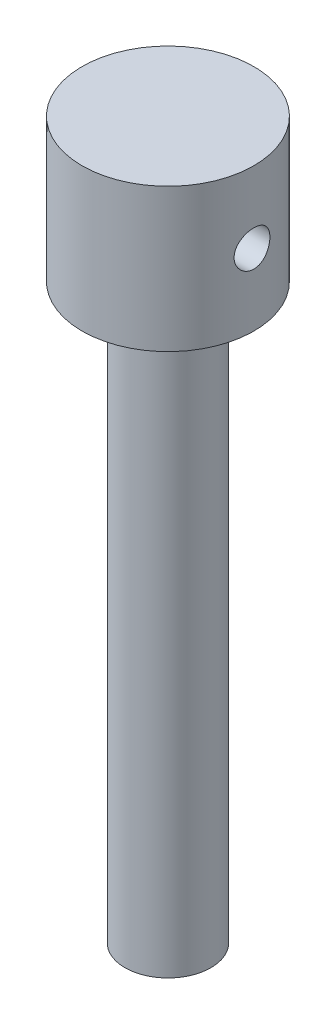
ISO-10303-21;
HEADER;
FILE_DESCRIPTION(('STEP AP214'),'2;1');
FILE_NAME('part.step','',(''),(''),'','','');
FILE_SCHEMA(('AUTOMOTIVE_DESIGN { 1 0 10303 214 1 1 1 1 }'));
ENDSEC;
DATA;
#1=APPLICATION_CONTEXT('core data for automotive mechanical design processes');
#2=APPLICATION_PROTOCOL_DEFINITION('international standard','automotive_design',2000,#1);
#3=PRODUCT_CONTEXT('',#1,'mechanical');
#4=PRODUCT('Part','Part','',(#3));
#5=PRODUCT_RELATED_PRODUCT_CATEGORY('part','',(#4));
#6=PRODUCT_DEFINITION_FORMATION('','',#4);
#7=PRODUCT_DEFINITION_CONTEXT('part definition',#1,'design');
#8=PRODUCT_DEFINITION('design','',#6,#7);
#9=PRODUCT_DEFINITION_SHAPE('','',#8);
#10=(LENGTH_UNIT() NAMED_UNIT(*) SI_UNIT(.MILLI.,.METRE.));
#11=(NAMED_UNIT(*) PLANE_ANGLE_UNIT() SI_UNIT($,.RADIAN.));
#12=(NAMED_UNIT(*) SI_UNIT($,.STERADIAN.) SOLID_ANGLE_UNIT());
#13=UNCERTAINTY_MEASURE_WITH_UNIT(LENGTH_MEASURE(1.E-05),#10,'distance_accuracy_value','');
#14=(GEOMETRIC_REPRESENTATION_CONTEXT(3) GLOBAL_UNCERTAINTY_ASSIGNED_CONTEXT((#13)) GLOBAL_UNIT_ASSIGNED_CONTEXT((#10,
#11,#12)) REPRESENTATION_CONTEXT('',''));
#15=CARTESIAN_POINT('',(0.,0.,0.));
#16=DIRECTION('',(0.,0.,1.));
#17=DIRECTION('',(1.,0.,0.));
#18=AXIS2_PLACEMENT_3D('',#15,#16,#17);
#19=CARTESIAN_POINT('',(0.,80.,0.));
#20=DIRECTION('',(0.,-1.,0.));
#21=DIRECTION('',(0.,0.,-1.));
#22=AXIS2_PLACEMENT_3D('',#19,#20,#21);
#23=CYLINDRICAL_SURFACE('',#22,6.);
#24=CARTESIAN_POINT('',(0.,80.,0.));
#25=DIRECTION('',(0.,1.,0.));
#26=DIRECTION('',(0.,0.,1.));
#27=AXIS2_PLACEMENT_3D('',#24,#25,#26);
#28=CIRCLE('',#27,6.);
#29=CARTESIAN_POINT('',(0.,80.,6.));
#30=VERTEX_POINT('',#29);
#31=EDGE_CURVE('E56',#30,#30,#28,.T.);
#32=ORIENTED_EDGE('',*,*,#31,.F.);
#33=EDGE_LOOP('',(#32));
#34=FACE_BOUND('',#33,.T.);
#35=CARTESIAN_POINT('',(0.,0.,0.));
#36=DIRECTION('',(0.,1.,0.));
#37=DIRECTION('',(0.,0.,1.));
#38=AXIS2_PLACEMENT_3D('',#35,#36,#37);
#39=CIRCLE('',#38,6.);
#40=CARTESIAN_POINT('',(0.,0.,6.));
#41=VERTEX_POINT('',#40);
#42=EDGE_CURVE('E60',#41,#41,#39,.T.);
#43=ORIENTED_EDGE('',*,*,#42,.T.);
#44=EDGE_LOOP('',(#43));
#45=FACE_BOUND('',#44,.T.);
#46=ADVANCED_FACE('F41',(#34,#45),#23,.T.);
#47=CARTESIAN_POINT('',(0.,0.,0.));
#48=DIRECTION('',(0.,1.,0.));
#49=DIRECTION('',(0.,0.,1.));
#50=AXIS2_PLACEMENT_3D('',#47,#48,#49);
#51=PLANE('',#50);
#52=ORIENTED_EDGE('',*,*,#42,.F.);
#53=EDGE_LOOP('',(#52));
#54=FACE_BOUND('',#53,.T.);
#55=ADVANCED_FACE('F86',(#54),#51,.F.);
#56=CARTESIAN_POINT('',(0.,100.,0.));
#57=DIRECTION('',(0.,-1.,0.));
#58=DIRECTION('',(0.,0.,-1.));
#59=AXIS2_PLACEMENT_3D('',#56,#57,#58);
#60=CYLINDRICAL_SURFACE('',#59,12.);
#61=CARTESIAN_POINT('',(-12.,87.5,0.));
#62=CARTESIAN_POINT('',(-11.999997430533,87.5000049549384,-0.138818083403322));
#63=CARTESIAN_POINT('',(-11.9975665755009,87.5116013314375,-0.277697579041752));
#64=CARTESIAN_POINT('',(-11.9881040198136,87.5576386990657,-0.551522632533988));
#65=CARTESIAN_POINT('',(-11.981068823785,87.5920970460739,-0.686465120256626));
#66=CARTESIAN_POINT('',(-11.963182183924,87.6827409098437,-0.948418264582685));
#67=CARTESIAN_POINT('',(-11.9523345410529,87.7389047919978,-1.07543667341837));
#68=CARTESIAN_POINT('',(-11.9279985561972,87.8712992177124,-1.31824065721192));
#69=CARTESIAN_POINT('',(-11.9145103325195,87.9475288623117,-1.43402673506865));
#70=CARTESIAN_POINT('',(-11.886154000493,88.1190726803813,-1.65278064861767));
#71=CARTESIAN_POINT('',(-11.8712701169706,88.2146240024702,-1.75556048832537));
#72=CARTESIAN_POINT('',(-11.841913153849,88.4215893183902,-1.94375555353879));
#73=CARTESIAN_POINT('',(-11.8274401083337,88.5330046237445,-2.02916934192198));
#74=CARTESIAN_POINT('',(-11.8003888519062,88.7699039375323,-2.18102063354433));
#75=CARTESIAN_POINT('',(-11.7878309034966,88.8955167690055,-2.24726109361302));
#76=CARTESIAN_POINT('',(-11.7662568130004,89.1563949035455,-2.35762238696128));
#77=CARTESIAN_POINT('',(-11.7572402893514,89.2916591648851,-2.40174560335283));
#78=CARTESIAN_POINT('',(-11.7439300197224,89.5659704748313,-2.46600480267474));
#79=CARTESIAN_POINT('',(-11.7395711371173,89.7049367186695,-2.48647195393598));
#80=CARTESIAN_POINT('',(-11.7358738143298,89.9843936857253,-2.5038671531123));
#81=CARTESIAN_POINT('',(-11.7365348160196,90.1248842377306,-2.50079781789374));
#82=CARTESIAN_POINT('',(-11.7427434863835,90.4009620559504,-2.47147438074394));
#83=CARTESIAN_POINT('',(-11.748210673598,90.5365919593224,-2.44560210465441));
#84=CARTESIAN_POINT('',(-11.7632887523188,90.8015430192899,-2.37201087059891));
#85=CARTESIAN_POINT('',(-11.7728998568263,90.9308638512127,-2.32429078962764));
#86=CARTESIAN_POINT('',(-11.795263829282,91.180614456832,-2.20800006427857));
#87=CARTESIAN_POINT('',(-11.8080390757117,91.3009725930542,-2.13928005068474));
#88=CARTESIAN_POINT('',(-11.8352778002144,91.5285914885363,-1.98304539854963));
#89=CARTESIAN_POINT('',(-11.8497414879707,91.635850617672,-1.89552842452517));
#90=CARTESIAN_POINT('',(-11.8790746185982,91.8364279221608,-1.70214984309357));
#91=CARTESIAN_POINT('',(-11.8939464639895,91.929432337794,-1.59596286682417));
#92=CARTESIAN_POINT('',(-11.92216176286,92.096360884458,-1.3693345772236));
#93=CARTESIAN_POINT('',(-11.9355051934047,92.1702847291968,-1.24889305005154));
#94=CARTESIAN_POINT('',(-11.9591974188563,92.2970201630719,-0.99681108247096));
#95=CARTESIAN_POINT('',(-11.9695407942052,92.3497936091342,-0.865150923853003));
#96=CARTESIAN_POINT('',(-11.9860267642256,92.432383409671,-0.594569241944315));
#97=CARTESIAN_POINT('',(-11.9921699119211,92.4622027864628,-0.455648677190184));
#98=CARTESIAN_POINT('',(-11.9994855043091,92.4975885041358,-0.177183731401676));
#99=CARTESIAN_POINT('',(-12.0007458707516,92.5035838829885,-0.0376961110523615));
#100=CARTESIAN_POINT('',(-11.9983990450555,92.4923101000618,0.240287597515427));
#101=CARTESIAN_POINT('',(-11.9947921509631,92.4750423627968,0.378783745924516));
#102=CARTESIAN_POINT('',(-11.9831712995837,92.418088693061,0.649452734239626));
#103=CARTESIAN_POINT('',(-11.9752010573615,92.3786250292331,0.78167438578841));
#104=CARTESIAN_POINT('',(-11.9557445448479,92.2786442791572,1.03762289332266));
#105=CARTESIAN_POINT('',(-11.9442579948916,92.2181255182681,1.16134907267355));
#106=CARTESIAN_POINT('',(-11.9188248298143,92.0768392435249,1.39858861388699));
#107=CARTESIAN_POINT('',(-11.9048478762466,91.9958161408619,1.51194643893967));
#108=CARTESIAN_POINT('',(-11.8760513659942,91.8161608738475,1.72361089177304));
#109=CARTESIAN_POINT('',(-11.8612317108502,91.7175266489621,1.82191575582657));
#110=CARTESIAN_POINT('',(-11.8321204906275,91.5034888460006,2.0023572973036));
#111=CARTESIAN_POINT('',(-11.81784178615,91.3878339360895,2.08419829200409));
#112=CARTESIAN_POINT('',(-11.7917120203161,91.1441674315724,2.22729438158487));
#113=CARTESIAN_POINT('',(-11.779860857893,91.0161563517218,2.28855033355728));
#114=CARTESIAN_POINT('',(-11.7600340141608,90.7520776074036,2.38834492887844));
#115=CARTESIAN_POINT('',(-11.7520374556937,90.6160579256683,2.42700619656063));
#116=CARTESIAN_POINT('',(-11.7407836941939,90.3392668990155,2.48088077046815));
#117=CARTESIAN_POINT('',(-11.7375258132073,90.1984962367611,2.49609743088882));
#118=CARTESIAN_POINT('',(-11.7361581461701,89.9191731980007,2.50251852975223));
#119=CARTESIAN_POINT('',(-11.73794804643,89.7806318595559,2.49419085245451));
#120=CARTESIAN_POINT('',(-11.7462489450985,89.5069719821596,2.45479810628064));
#121=CARTESIAN_POINT('',(-11.7527598981925,89.3718534103678,2.42373325564532));
#122=CARTESIAN_POINT('',(-11.7697226489543,89.1092044562187,2.3399643553717));
#123=CARTESIAN_POINT('',(-11.7801631401586,88.9816535070262,2.28732235136843));
#124=CARTESIAN_POINT('',(-11.8038141147748,88.7371224479467,2.16194914599515));
#125=CARTESIAN_POINT('',(-11.8170248553092,88.6201433207338,2.08921607966061));
#126=CARTESIAN_POINT('',(-11.8450315910229,88.3977567458411,1.92414739068483));
#127=CARTESIAN_POINT('',(-11.8598522773681,88.29260175087,1.83147578083645));
#128=CARTESIAN_POINT('',(-11.8892367916643,88.0991810135473,1.62984887623067));
#129=CARTESIAN_POINT('',(-11.9038005596976,88.010919164897,1.52088983766594));
#130=CARTESIAN_POINT('',(-11.9312288909527,87.8528228536319,1.28826885501542));
#131=CARTESIAN_POINT('',(-11.9440719214649,87.7832126402274,1.16445184304271));
#132=CARTESIAN_POINT('',(-11.9663981698818,87.66589954314,0.906639687996913));
#133=CARTESIAN_POINT('',(-11.975884323642,87.6181775056362,0.772653563814491));
#134=CARTESIAN_POINT('',(-11.9886499956289,87.5549194434232,0.532030585800209));
#135=CARTESIAN_POINT('',(-11.9928807132279,87.5343624735823,0.426735187455856));
#136=CARTESIAN_POINT('',(-11.9985566557952,87.5069010914453,0.214305348353072));
#137=CARTESIAN_POINT('',(-12.0000019836917,87.4999961746656,0.107170975697743));
#138=CARTESIAN_POINT('',(-12.,87.5,0.));
#139=B_SPLINE_CURVE_WITH_KNOTS('',3,(#61,#62,#63,#64,#65,#66,#67,#68,#69,#70,#71,#72,#73,#74,
#75,#76,#77,#78,#79,#80,#81,#82,#83,#84,#85,#86,#87,#88,#89,#90,#91,#92,#93,#94,#95,#96,#97,#98,
#99,#100,#101,#102,#103,#104,#105,#106,#107,#108,#109,#110,#111,#112,#113,#114,#115,#116,#117,
#118,#119,#120,#121,#122,#123,#124,#125,#126,#127,#128,#129,#130,#131,#132,#133,#134,#135,#136,
#137,#138),.UNSPECIFIED.,.T.,.F.,(4,2,2,2,2,2,2,2,2,2,2,2,2,2,2,2,2,2,2,2,2,2,2,2,2,2,2,2,2,2,2,
2,2,2,2,2,2,2,4),(0.,0.416062090206368,0.832440399812451,1.24840475765089,1.66435048314598,
2.08575052776244,2.50718543103572,2.93280898357096,3.35838666570981,3.77793150339709,
4.1974296953433,4.61003424258119,5.0226600006056,5.43829184833499,5.85397536736069,
6.27779052710931,6.70161204556436,7.12619448999324,7.55072102091542,7.96756678815351,
8.38438703104555,8.79710573265243,9.20985726781866,9.62803167991474,10.0462550512915,
10.4714252765867,10.8965777970262,11.3194010019005,11.7421637082837,12.1565844658208,
12.5710012456272,12.9842346278651,13.3975063816296,13.8183804966062,14.2393515023474,
14.6651772879651,15.0906297292995,15.4118517695456,15.7330619394678),.UNSPECIFIED.);
#140=CARTESIAN_POINT('',(-12.,87.5,0.));
#141=VERTEX_POINT('',#140);
#142=EDGE_CURVE('E10',#141,#141,#139,.T.);
#143=ORIENTED_EDGE('',*,*,#142,.T.);
#144=EDGE_LOOP('',(#143));
#145=FACE_BOUND('',#144,.T.);
#146=CARTESIAN_POINT('',(11.7366945943055,90.,-2.5));
#147=CARTESIAN_POINT('',(11.7366973843002,89.8612187696963,-2.499995017553));
#148=CARTESIAN_POINT('',(11.7391829184982,89.7223760559691,-2.48840458867923));
#149=CARTESIAN_POINT('',(11.7488403116286,89.448627365366,-2.44239298467531));
#150=CARTESIAN_POINT('',(11.7560157627658,89.3137244889873,-2.40795430880677));
#151=CARTESIAN_POINT('',(11.7742058592406,89.0518552543301,-2.31736795014468));
#152=CARTESIAN_POINT('',(11.7852165141394,88.9248808080164,-2.26124282497867));
#153=CARTESIAN_POINT('',(11.8098316267143,88.6821510007088,-2.12893977203463));
#154=CARTESIAN_POINT('',(11.8234359795523,88.56639518654,-2.05276265471639));
#155=CARTESIAN_POINT('',(11.8519386932295,88.3476092496931,-1.88127279893217));
#156=CARTESIAN_POINT('',(11.8668522874608,88.2447762127471,-1.78571110973934));
#157=CARTESIAN_POINT('',(11.8961593360515,88.0564778627038,-1.57870244776127));
#158=CARTESIAN_POINT('',(11.9105527521983,87.9710138234171,-1.467254310912));
#159=CARTESIAN_POINT('',(11.937362702377,87.8191082238343,-1.23032410599918));
#160=CARTESIAN_POINT('',(11.9497591726249,87.7528549470735,-1.10471885640988));
#161=CARTESIAN_POINT('',(11.971006946866,87.6424678942805,-0.843857102013438));
#162=CARTESIAN_POINT('',(11.9798586112245,87.5983318696929,-0.708601579901186));
#163=CARTESIAN_POINT('',(11.9929117978436,87.5340484777651,-0.434325808401012));
#164=CARTESIAN_POINT('',(11.9971778391985,87.5135679656097,-0.295386761832721));
#165=CARTESIAN_POINT('',(12.0008022516122,87.496136608486,-0.015983697679052));
#166=CARTESIAN_POINT('',(12.0001611340738,87.4991833116138,0.124480159473674));
#167=CARTESIAN_POINT('',(11.9940931618102,87.5284692019135,0.400653172399141));
#168=CARTESIAN_POINT('',(11.9887403791317,87.5543494379162,0.536402257452948));
#169=CARTESIAN_POINT('',(11.9739344179777,87.6279972506626,0.801587492579502));
#170=CARTESIAN_POINT('',(11.9644810658381,87.6757657544062,0.931023375022043));
#171=CARTESIAN_POINT('',(11.9424153464785,87.792160104251,1.18092001076937));
#172=CARTESIAN_POINT('',(11.9297820825069,87.8609245884193,1.3013142699633));
#173=CARTESIAN_POINT('',(11.9027460088038,88.0172560056808,1.5289869130213));
#174=CARTESIAN_POINT('',(11.8883429791665,88.1048252764123,1.63626366363284));
#175=CARTESIAN_POINT('',(11.8590340046655,88.2982432497821,1.83678840655382));
#176=CARTESIAN_POINT('',(11.8441236995185,88.4044061199639,1.92973297498959));
#177=CARTESIAN_POINT('',(11.8157374529799,88.6309640979896,2.09655194480976));
#178=CARTESIAN_POINT('',(11.8022615435432,88.7513595227745,2.1704259213996));
#179=CARTESIAN_POINT('',(11.7782599681831,89.0034245096576,2.29712434276909));
#180=CARTESIAN_POINT('',(11.7677417046425,89.1351213013869,2.34989610979455));
#181=CARTESIAN_POINT('',(11.7509521282072,89.4057832387388,2.43247155077345));
#182=CARTESIAN_POINT('',(11.7446802101436,89.5447473456162,2.46227849764697));
#183=CARTESIAN_POINT('',(11.7372156647826,89.8232394126378,2.49761727734035));
#184=CARTESIAN_POINT('',(11.7359310372695,89.9627091690741,2.50358885835997));
#185=CARTESIAN_POINT('',(11.7383390403741,90.2406516230803,2.49227386878589));
#186=CARTESIAN_POINT('',(11.7420313630525,90.3791243818047,2.47498873715726));
#187=CARTESIAN_POINT('',(11.7538907645233,90.6496410321163,2.41803116650968));
#188=CARTESIAN_POINT('',(11.76201022566,90.7817373343577,2.37859682753743));
#189=CARTESIAN_POINT('',(11.7817667700624,91.0374479788832,2.27871621721838));
#190=CARTESIAN_POINT('',(11.7934041638211,91.1610615713008,2.21826809112292));
#191=CARTESIAN_POINT('',(11.8190900387438,91.3982128824325,2.07709196362969));
#192=CARTESIAN_POINT('',(11.8331701329665,91.5115844089324,1.99609065470792));
#193=CARTESIAN_POINT('',(11.8620696798782,91.7232864983101,1.81646888113976));
#194=CARTESIAN_POINT('',(11.8768892153306,91.8216153724785,1.71784644101035));
#195=CARTESIAN_POINT('',(11.9058984863347,92.0021254261944,1.50380090168668));
#196=CARTESIAN_POINT('',(11.9200734943982,92.0840081900528,1.3881238152291));
#197=CARTESIAN_POINT('',(11.9459341754481,92.227177504176,1.14440020443272));
#198=CARTESIAN_POINT('',(11.9576199584164,92.2884649644749,1.01635422695377));
#199=CARTESIAN_POINT('',(11.9771229654136,92.3882773586347,0.752284235695844));
#200=CARTESIAN_POINT('',(11.9849632627299,92.4269383310887,0.616313421940395));
#201=CARTESIAN_POINT('',(11.9959912282046,92.4808288080162,0.339626801006947));
#202=CARTESIAN_POINT('',(11.9991795068579,92.4960613870655,0.198911618923389));
#203=CARTESIAN_POINT('',(12.0005281611387,92.502535244097,-0.0804266869406682));
#204=CARTESIAN_POINT('',(11.9987822750957,92.4942237999895,-0.219039184355818));
#205=CARTESIAN_POINT('',(11.99065748189,92.4548387226941,-0.492845740747125));
#206=CARTESIAN_POINT('',(11.9842786434588,92.4237654271863,-0.628039850405488));
#207=CARTESIAN_POINT('',(11.9676092015489,92.339944410703,-0.890863930984019));
#208=CARTESIAN_POINT('',(11.9573290681437,92.2872546722944,-1.01851310000873));
#209=CARTESIAN_POINT('',(11.9339599069615,92.1617552045355,-1.26322113444179));
#210=CARTESIAN_POINT('',(11.9208706346327,92.0889437233117,-1.38027907656019));
#211=CARTESIAN_POINT('',(11.8930319356995,91.9237806640155,-1.60268064259533));
#212=CARTESIAN_POINT('',(11.8782576059507,91.8311114238945,-1.70778526722738));
#213=CARTESIAN_POINT('',(11.8488557363333,91.6295109979979,-1.90110548396523));
#214=CARTESIAN_POINT('',(11.8342282323044,91.5205759400736,-1.98931704315914));
#215=CARTESIAN_POINT('',(11.8065838324643,91.287981795159,-2.14734903704121));
#216=CARTESIAN_POINT('',(11.7935881325424,91.1641631771794,-2.21693856248136));
#217=CARTESIAN_POINT('',(11.7709407916825,90.9063496879379,-2.3342125584477));
#218=CARTESIAN_POINT('',(11.7612862067076,90.7723639031215,-2.381916325835));
#219=CARTESIAN_POINT('',(11.7482800883641,90.5317874368468,-2.44513108264677));
#220=CARTESIAN_POINT('',(11.7439632719021,90.4265409268095,-2.46566898011599));
#221=CARTESIAN_POINT('',(11.7381695052653,90.2142084389624,-2.4931050871655));
#222=CARTESIAN_POINT('',(11.7366924407628,90.1071225353813,-2.50000384585404));
#223=CARTESIAN_POINT('',(11.7366945943055,90.,-2.5));
#224=B_SPLINE_CURVE_WITH_KNOTS('',3,(#146,#147,#148,#149,#150,#151,#152,#153,#154,#155,#156,
#157,#158,#159,#160,#161,#162,#163,#164,#165,#166,#167,#168,#169,#170,#171,#172,#173,#174,#175,
#176,#177,#178,#179,#180,#181,#182,#183,#184,#185,#186,#187,#188,#189,#190,#191,#192,#193,#194,
#195,#196,#197,#198,#199,#200,#201,#202,#203,#204,#205,#206,#207,#208,#209,#210,#211,#212,#213,
#214,#215,#216,#217,#218,#219,#220,#221,#222,#223),.UNSPECIFIED.,.T.,.F.,(4,2,2,2,2,2,2,2,2,2,2,
2,2,2,2,2,2,2,2,2,2,2,2,2,2,2,2,2,2,2,2,2,2,2,2,2,2,2,4),(0.,0.415951308142525,0.83222158483494,
1.24806002960546,1.66388166963158,2.08542666935771,2.50700257327748,2.93258052533688,
3.35811520213866,3.77758097718529,4.19700303792678,4.60994682832922,5.02290810911741,
5.43865743955899,5.8544584820852,6.27811724489827,6.70178544383257,7.12650474664976,
7.55116350775193,7.96795032019584,8.38471134593048,8.79707572463848,9.20947650928062,
9.62767835869304,10.0459271216437,10.4711891750669,10.8964324351808,11.3190919929707,
11.7416960791916,12.1563258784529,12.5709495266596,12.984468211702,13.3980229105635,
13.8187663795715,14.2396101685507,14.6654530271772,15.0909196914727,15.4119973517483,
15.7330620852562),.UNSPECIFIED.);
#225=CARTESIAN_POINT('',(11.7366945943055,90.,-2.5));
#226=VERTEX_POINT('',#225);
#227=EDGE_CURVE('E52',#226,#226,#224,.T.);
#228=ORIENTED_EDGE('',*,*,#227,.T.);
#229=EDGE_LOOP('',(#228));
#230=FACE_BOUND('',#229,.T.);
#231=CARTESIAN_POINT('',(0.,100.,0.));
#232=DIRECTION('',(0.,1.,0.));
#233=DIRECTION('',(0.,0.,1.));
#234=AXIS2_PLACEMENT_3D('',#231,#232,#233);
#235=CIRCLE('',#234,12.);
#236=CARTESIAN_POINT('',(0.,100.,12.));
#237=VERTEX_POINT('',#236);
#238=EDGE_CURVE('E96',#237,#237,#235,.T.);
#239=ORIENTED_EDGE('',*,*,#238,.F.);
#240=EDGE_LOOP('',(#239));
#241=FACE_BOUND('',#240,.T.);
#242=CARTESIAN_POINT('',(0.,80.,0.));
#243=DIRECTION('',(0.,1.,0.));
#244=DIRECTION('',(0.,0.,1.));
#245=AXIS2_PLACEMENT_3D('',#242,#243,#244);
#246=CIRCLE('',#245,12.);
#247=CARTESIAN_POINT('',(0.,80.,12.));
#248=VERTEX_POINT('',#247);
#249=EDGE_CURVE('E98',#248,#248,#246,.T.);
#250=ORIENTED_EDGE('',*,*,#249,.T.);
#251=EDGE_LOOP('',(#250));
#252=FACE_BOUND('',#251,.T.);
#253=ADVANCED_FACE('F66',(#145,#230,#241,#252),#60,.T.);
#254=CARTESIAN_POINT('',(0.,100.,0.));
#255=DIRECTION('',(0.,1.,0.));
#256=DIRECTION('',(0.,0.,1.));
#257=AXIS2_PLACEMENT_3D('',#254,#255,#256);
#258=PLANE('',#257);
#259=ORIENTED_EDGE('',*,*,#238,.T.);
#260=EDGE_LOOP('',(#259));
#261=FACE_BOUND('',#260,.T.);
#262=ADVANCED_FACE('F75',(#261),#258,.T.);
#263=CARTESIAN_POINT('',(0.,80.,0.));
#264=DIRECTION('',(0.,1.,0.));
#265=DIRECTION('',(0.,0.,1.));
#266=AXIS2_PLACEMENT_3D('',#263,#264,#265);
#267=PLANE('',#266);
#268=ORIENTED_EDGE('',*,*,#31,.T.);
#269=EDGE_LOOP('',(#268));
#270=FACE_BOUND('',#269,.T.);
#271=ORIENTED_EDGE('',*,*,#249,.F.);
#272=EDGE_LOOP('',(#271));
#273=FACE_BOUND('',#272,.T.);
#274=ADVANCED_FACE('F73',(#270,#273),#267,.F.);
#275=CARTESIAN_POINT('',(-12.,90.,0.));
#276=DIRECTION('',(1.,0.,0.));
#277=DIRECTION('',(0.,0.,-1.));
#278=AXIS2_PLACEMENT_3D('',#275,#276,#277);
#279=CYLINDRICAL_SURFACE('',#278,2.5);
#280=ORIENTED_EDGE('',*,*,#227,.F.);
#281=EDGE_LOOP('',(#280));
#282=FACE_BOUND('',#281,.T.);
#283=ORIENTED_EDGE('',*,*,#142,.F.);
#284=EDGE_LOOP('',(#283));
#285=FACE_BOUND('',#284,.T.);
#286=ADVANCED_FACE('F69',(#282,#285),#279,.F.);
#287=CLOSED_SHELL('',(#46,#55,#253,#262,#274,#286));
#288=MANIFOLD_SOLID_BREP('B2',#287);
#289=ADVANCED_BREP_SHAPE_REPRESENTATION('',(#18,#288),#14);
#290=SHAPE_DEFINITION_REPRESENTATION(#9,#289);
ENDSEC;
END-ISO-10303-21;
